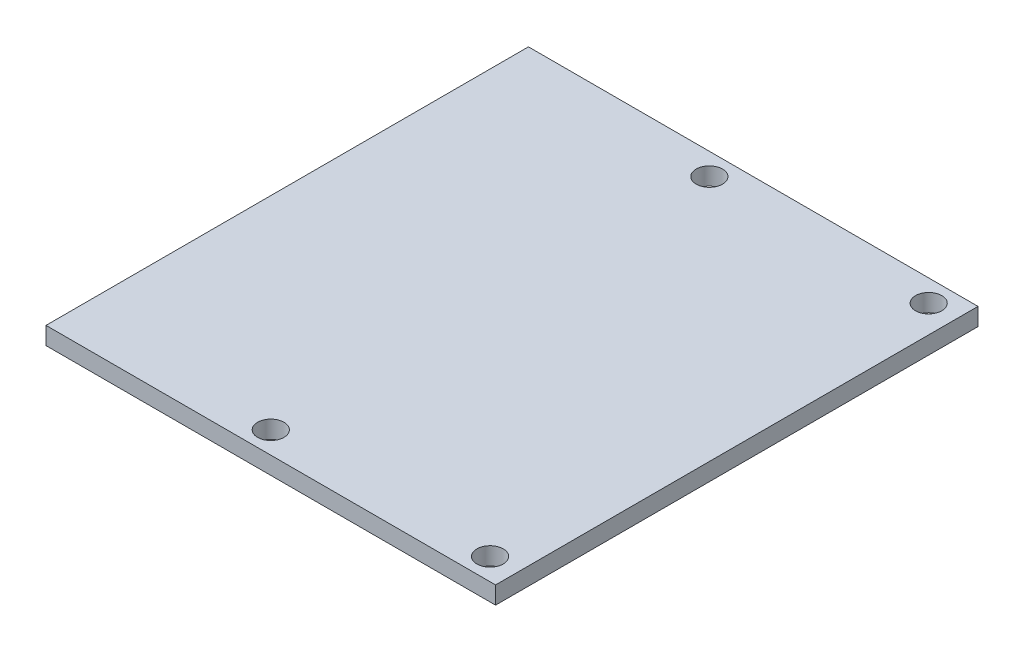
ISO-10303-21;
HEADER;
FILE_DESCRIPTION(('STEP AP214'),'2;1');
FILE_NAME('part.step','',(''),(''),'','','');
FILE_SCHEMA(('AUTOMOTIVE_DESIGN { 1 0 10303 214 1 1 1 1 }'));
ENDSEC;
DATA;
#1=APPLICATION_CONTEXT('core data for automotive mechanical design processes');
#2=APPLICATION_PROTOCOL_DEFINITION('international standard','automotive_design',2000,#1);
#3=PRODUCT_CONTEXT('',#1,'mechanical');
#4=PRODUCT('Part','Part','',(#3));
#5=PRODUCT_RELATED_PRODUCT_CATEGORY('part','',(#4));
#6=PRODUCT_DEFINITION_FORMATION('','',#4);
#7=PRODUCT_DEFINITION_CONTEXT('part definition',#1,'design');
#8=PRODUCT_DEFINITION('design','',#6,#7);
#9=PRODUCT_DEFINITION_SHAPE('','',#8);
#10=(LENGTH_UNIT() NAMED_UNIT(*) SI_UNIT(.MILLI.,.METRE.));
#11=(NAMED_UNIT(*) PLANE_ANGLE_UNIT() SI_UNIT($,.RADIAN.));
#12=(NAMED_UNIT(*) SI_UNIT($,.STERADIAN.) SOLID_ANGLE_UNIT());
#13=UNCERTAINTY_MEASURE_WITH_UNIT(LENGTH_MEASURE(1.E-05),#10,'distance_accuracy_value','');
#14=(GEOMETRIC_REPRESENTATION_CONTEXT(3) GLOBAL_UNCERTAINTY_ASSIGNED_CONTEXT((#13)) GLOBAL_UNIT_ASSIGNED_CONTEXT((#10,
#11,#12)) REPRESENTATION_CONTEXT('',''));
#15=CARTESIAN_POINT('',(0.,0.,0.));
#16=DIRECTION('',(0.,0.,1.));
#17=DIRECTION('',(1.,0.,0.));
#18=AXIS2_PLACEMENT_3D('',#15,#16,#17);
#19=CARTESIAN_POINT('',(0.,1.6,0.));
#20=DIRECTION('',(0.,0.,-1.));
#21=DIRECTION('',(-1.,0.,0.));
#22=AXIS2_PLACEMENT_3D('',#19,#20,#21);
#23=PLANE('',#22);
#24=DIRECTION('',(1.,0.,0.));
#25=VECTOR('',#24,1.);
#26=CARTESIAN_POINT('',(0.,0.,0.));
#27=LINE('',#26,#25);
#28=CARTESIAN_POINT('',(0.,0.,0.));
#29=VERTEX_POINT('',#28);
#30=CARTESIAN_POINT('',(41.,0.,0.));
#31=VERTEX_POINT('',#30);
#32=EDGE_CURVE('E116',#29,#31,#27,.T.);
#33=ORIENTED_EDGE('',*,*,#32,.T.);
#34=DIRECTION('',(0.,-1.,0.));
#35=VECTOR('',#34,1.);
#36=CARTESIAN_POINT('',(41.,1.6,0.));
#37=LINE('',#36,#35);
#38=CARTESIAN_POINT('',(41.,1.6,0.));
#39=VERTEX_POINT('',#38);
#40=EDGE_CURVE('E11',#39,#31,#37,.T.);
#41=ORIENTED_EDGE('',*,*,#40,.F.);
#42=DIRECTION('',(1.,0.,0.));
#43=VECTOR('',#42,1.);
#44=CARTESIAN_POINT('',(0.,1.6,0.));
#45=LINE('',#44,#43);
#46=CARTESIAN_POINT('',(0.,1.6,0.));
#47=VERTEX_POINT('',#46);
#48=EDGE_CURVE('E89',#47,#39,#45,.T.);
#49=ORIENTED_EDGE('',*,*,#48,.F.);
#50=DIRECTION('',(0.,-1.,0.));
#51=VECTOR('',#50,1.);
#52=CARTESIAN_POINT('',(0.,1.6,0.));
#53=LINE('',#52,#51);
#54=EDGE_CURVE('E56',#47,#29,#53,.T.);
#55=ORIENTED_EDGE('',*,*,#54,.T.);
#56=EDGE_LOOP('',(#33,#41,#49,#55));
#57=FACE_BOUND('',#56,.T.);
#58=ADVANCED_FACE('F39',(#57),#23,.F.);
#59=CARTESIAN_POINT('',(41.,1.6,0.));
#60=DIRECTION('',(-1.,0.,0.));
#61=DIRECTION('',(0.,0.,1.));
#62=AXIS2_PLACEMENT_3D('',#59,#60,#61);
#63=PLANE('',#62);
#64=DIRECTION('',(0.,0.,-1.));
#65=VECTOR('',#64,1.);
#66=CARTESIAN_POINT('',(41.,0.,0.));
#67=LINE('',#66,#65);
#68=CARTESIAN_POINT('',(41.,0.,-44.));
#69=VERTEX_POINT('',#68);
#70=EDGE_CURVE('E94',#31,#69,#67,.T.);
#71=ORIENTED_EDGE('',*,*,#70,.T.);
#72=DIRECTION('',(0.,-1.,0.));
#73=VECTOR('',#72,1.);
#74=CARTESIAN_POINT('',(41.,1.6,-44.));
#75=LINE('',#74,#73);
#76=CARTESIAN_POINT('',(41.,1.6,-44.));
#77=VERTEX_POINT('',#76);
#78=EDGE_CURVE('E48',#77,#69,#75,.T.);
#79=ORIENTED_EDGE('',*,*,#78,.F.);
#80=DIRECTION('',(0.,0.,-1.));
#81=VECTOR('',#80,1.);
#82=CARTESIAN_POINT('',(41.,1.6,0.));
#83=LINE('',#82,#81);
#84=EDGE_CURVE('E81',#39,#77,#83,.T.);
#85=ORIENTED_EDGE('',*,*,#84,.F.);
#86=ORIENTED_EDGE('',*,*,#40,.T.);
#87=EDGE_LOOP('',(#71,#79,#85,#86));
#88=FACE_BOUND('',#87,.T.);
#89=ADVANCED_FACE('F93',(#88),#63,.F.);
#90=CARTESIAN_POINT('',(0.,1.6,-44.));
#91=DIRECTION('',(0.,0.,-1.));
#92=DIRECTION('',(-1.,0.,0.));
#93=AXIS2_PLACEMENT_3D('',#90,#91,#92);
#94=PLANE('',#93);
#95=DIRECTION('',(1.,0.,0.));
#96=VECTOR('',#95,1.);
#97=CARTESIAN_POINT('',(0.,0.,-44.));
#98=LINE('',#97,#96);
#99=CARTESIAN_POINT('',(0.,0.,-44.));
#100=VERTEX_POINT('',#99);
#101=EDGE_CURVE('E119',#100,#69,#98,.T.);
#102=ORIENTED_EDGE('',*,*,#101,.F.);
#103=DIRECTION('',(0.,-1.,0.));
#104=VECTOR('',#103,1.);
#105=CARTESIAN_POINT('',(0.,1.6,-44.));
#106=LINE('',#105,#104);
#107=CARTESIAN_POINT('',(0.,1.6,-44.));
#108=VERTEX_POINT('',#107);
#109=EDGE_CURVE('E70',#108,#100,#106,.T.);
#110=ORIENTED_EDGE('',*,*,#109,.F.);
#111=DIRECTION('',(1.,0.,0.));
#112=VECTOR('',#111,1.);
#113=CARTESIAN_POINT('',(0.,1.6,-44.));
#114=LINE('',#113,#112);
#115=EDGE_CURVE('E88',#108,#77,#114,.T.);
#116=ORIENTED_EDGE('',*,*,#115,.T.);
#117=ORIENTED_EDGE('',*,*,#78,.T.);
#118=EDGE_LOOP('',(#102,#110,#116,#117));
#119=FACE_BOUND('',#118,.T.);
#120=ADVANCED_FACE('F97',(#119),#94,.T.);
#121=CARTESIAN_POINT('',(38.5,1.6,-2.));
#122=DIRECTION('',(0.,-1.,0.));
#123=DIRECTION('',(0.,0.,-1.));
#124=AXIS2_PLACEMENT_3D('',#121,#122,#123);
#125=CYLINDRICAL_SURFACE('',#124,1.2);
#126=CARTESIAN_POINT('',(38.5,1.6,-2.));
#127=DIRECTION('',(0.,1.,0.));
#128=DIRECTION('',(0.,0.,1.));
#129=AXIS2_PLACEMENT_3D('',#126,#127,#128);
#130=CIRCLE('',#129,1.2);
#131=CARTESIAN_POINT('',(38.5,1.6,-0.8));
#132=VERTEX_POINT('',#131);
#133=EDGE_CURVE('E138',#132,#132,#130,.T.);
#134=ORIENTED_EDGE('',*,*,#133,.T.);
#135=EDGE_LOOP('',(#134));
#136=FACE_BOUND('',#135,.T.);
#137=CARTESIAN_POINT('',(38.5,0.,-2.));
#138=DIRECTION('',(0.,1.,0.));
#139=DIRECTION('',(0.,0.,1.));
#140=AXIS2_PLACEMENT_3D('',#137,#138,#139);
#141=CIRCLE('',#140,1.2);
#142=CARTESIAN_POINT('',(38.5,0.,-0.8));
#143=VERTEX_POINT('',#142);
#144=EDGE_CURVE('E113',#143,#143,#141,.T.);
#145=ORIENTED_EDGE('',*,*,#144,.F.);
#146=EDGE_LOOP('',(#145));
#147=FACE_BOUND('',#146,.T.);
#148=ADVANCED_FACE('F142',(#136,#147),#125,.F.);
#149=CARTESIAN_POINT('',(38.5,1.6,-42.));
#150=DIRECTION('',(0.,-1.,0.));
#151=DIRECTION('',(0.,0.,-1.));
#152=AXIS2_PLACEMENT_3D('',#149,#150,#151);
#153=CYLINDRICAL_SURFACE('',#152,1.2);
#154=CARTESIAN_POINT('',(38.5,1.6,-42.));
#155=DIRECTION('',(0.,1.,0.));
#156=DIRECTION('',(0.,0.,1.));
#157=AXIS2_PLACEMENT_3D('',#154,#155,#156);
#158=CIRCLE('',#157,1.2);
#159=CARTESIAN_POINT('',(38.5,1.6,-40.8));
#160=VERTEX_POINT('',#159);
#161=EDGE_CURVE('E133',#160,#160,#158,.T.);
#162=ORIENTED_EDGE('',*,*,#161,.T.);
#163=EDGE_LOOP('',(#162));
#164=FACE_BOUND('',#163,.T.);
#165=CARTESIAN_POINT('',(38.5,0.,-42.));
#166=DIRECTION('',(0.,1.,0.));
#167=DIRECTION('',(0.,0.,1.));
#168=AXIS2_PLACEMENT_3D('',#165,#166,#167);
#169=CIRCLE('',#168,1.2);
#170=CARTESIAN_POINT('',(38.5,0.,-40.8));
#171=VERTEX_POINT('',#170);
#172=EDGE_CURVE('E110',#171,#171,#169,.T.);
#173=ORIENTED_EDGE('',*,*,#172,.F.);
#174=EDGE_LOOP('',(#173));
#175=FACE_BOUND('',#174,.T.);
#176=ADVANCED_FACE('F168',(#164,#175),#153,.F.);
#177=CARTESIAN_POINT('',(18.5,1.6,-42.));
#178=DIRECTION('',(0.,-1.,0.));
#179=DIRECTION('',(0.,0.,-1.));
#180=AXIS2_PLACEMENT_3D('',#177,#178,#179);
#181=CYLINDRICAL_SURFACE('',#180,1.2);
#182=CARTESIAN_POINT('',(18.5,1.6,-42.));
#183=DIRECTION('',(0.,1.,0.));
#184=DIRECTION('',(0.,0.,1.));
#185=AXIS2_PLACEMENT_3D('',#182,#183,#184);
#186=CIRCLE('',#185,1.2);
#187=CARTESIAN_POINT('',(18.5,1.6,-40.8));
#188=VERTEX_POINT('',#187);
#189=EDGE_CURVE('E128',#188,#188,#186,.T.);
#190=ORIENTED_EDGE('',*,*,#189,.T.);
#191=EDGE_LOOP('',(#190));
#192=FACE_BOUND('',#191,.T.);
#193=CARTESIAN_POINT('',(18.5,0.,-42.));
#194=DIRECTION('',(0.,1.,0.));
#195=DIRECTION('',(0.,0.,1.));
#196=AXIS2_PLACEMENT_3D('',#193,#194,#195);
#197=CIRCLE('',#196,1.2);
#198=CARTESIAN_POINT('',(18.5,0.,-40.8));
#199=VERTEX_POINT('',#198);
#200=EDGE_CURVE('E107',#199,#199,#197,.T.);
#201=ORIENTED_EDGE('',*,*,#200,.F.);
#202=EDGE_LOOP('',(#201));
#203=FACE_BOUND('',#202,.T.);
#204=ADVANCED_FACE('F170',(#192,#203),#181,.F.);
#205=CARTESIAN_POINT('',(18.5,1.6,-2.));
#206=DIRECTION('',(0.,-1.,0.));
#207=DIRECTION('',(0.,0.,-1.));
#208=AXIS2_PLACEMENT_3D('',#205,#206,#207);
#209=CYLINDRICAL_SURFACE('',#208,1.2);
#210=CARTESIAN_POINT('',(18.5,1.6,-2.));
#211=DIRECTION('',(0.,1.,0.));
#212=DIRECTION('',(0.,0.,1.));
#213=AXIS2_PLACEMENT_3D('',#210,#211,#212);
#214=CIRCLE('',#213,1.2);
#215=CARTESIAN_POINT('',(18.5,1.6,-0.8));
#216=VERTEX_POINT('',#215);
#217=EDGE_CURVE('E124',#216,#216,#214,.T.);
#218=ORIENTED_EDGE('',*,*,#217,.T.);
#219=EDGE_LOOP('',(#218));
#220=FACE_BOUND('',#219,.T.);
#221=CARTESIAN_POINT('',(18.5,0.,-2.));
#222=DIRECTION('',(0.,1.,0.));
#223=DIRECTION('',(0.,0.,1.));
#224=AXIS2_PLACEMENT_3D('',#221,#222,#223);
#225=CIRCLE('',#224,1.2);
#226=CARTESIAN_POINT('',(18.5,0.,-0.8));
#227=VERTEX_POINT('',#226);
#228=EDGE_CURVE('E104',#227,#227,#225,.T.);
#229=ORIENTED_EDGE('',*,*,#228,.F.);
#230=EDGE_LOOP('',(#229));
#231=FACE_BOUND('',#230,.T.);
#232=ADVANCED_FACE('F41',(#220,#231),#209,.F.);
#233=CARTESIAN_POINT('',(0.,1.6,0.));
#234=DIRECTION('',(-1.,0.,0.));
#235=DIRECTION('',(0.,0.,1.));
#236=AXIS2_PLACEMENT_3D('',#233,#234,#235);
#237=PLANE('',#236);
#238=DIRECTION('',(0.,0.,-1.));
#239=VECTOR('',#238,1.);
#240=CARTESIAN_POINT('',(0.,0.,0.));
#241=LINE('',#240,#239);
#242=EDGE_CURVE('E121',#29,#100,#241,.T.);
#243=ORIENTED_EDGE('',*,*,#242,.F.);
#244=ORIENTED_EDGE('',*,*,#54,.F.);
#245=DIRECTION('',(0.,0.,-1.));
#246=VECTOR('',#245,1.);
#247=CARTESIAN_POINT('',(0.,1.6,0.));
#248=LINE('',#247,#246);
#249=EDGE_CURVE('E98',#47,#108,#248,.T.);
#250=ORIENTED_EDGE('',*,*,#249,.T.);
#251=ORIENTED_EDGE('',*,*,#109,.T.);
#252=EDGE_LOOP('',(#243,#244,#250,#251));
#253=FACE_BOUND('',#252,.T.);
#254=ADVANCED_FACE('F147',(#253),#237,.T.);
#255=CARTESIAN_POINT('',(0.,1.6,0.));
#256=DIRECTION('',(0.,1.,0.));
#257=DIRECTION('',(0.,0.,1.));
#258=AXIS2_PLACEMENT_3D('',#255,#256,#257);
#259=PLANE('',#258);
#260=ORIENTED_EDGE('',*,*,#217,.F.);
#261=EDGE_LOOP('',(#260));
#262=FACE_BOUND('',#261,.T.);
#263=ORIENTED_EDGE('',*,*,#189,.F.);
#264=EDGE_LOOP('',(#263));
#265=FACE_BOUND('',#264,.T.);
#266=ORIENTED_EDGE('',*,*,#161,.F.);
#267=EDGE_LOOP('',(#266));
#268=FACE_BOUND('',#267,.T.);
#269=ORIENTED_EDGE('',*,*,#133,.F.);
#270=EDGE_LOOP('',(#269));
#271=FACE_BOUND('',#270,.T.);
#272=ORIENTED_EDGE('',*,*,#48,.T.);
#273=ORIENTED_EDGE('',*,*,#84,.T.);
#274=ORIENTED_EDGE('',*,*,#115,.F.);
#275=ORIENTED_EDGE('',*,*,#249,.F.);
#276=EDGE_LOOP('',(#272,#273,#274,#275));
#277=FACE_BOUND('',#276,.T.);
#278=ADVANCED_FACE('F85',(#262,#265,#268,#271,#277),#259,.T.);
#279=CARTESIAN_POINT('',(0.,0.,0.));
#280=DIRECTION('',(0.,1.,0.));
#281=DIRECTION('',(0.,0.,1.));
#282=AXIS2_PLACEMENT_3D('',#279,#280,#281);
#283=PLANE('',#282);
#284=ORIENTED_EDGE('',*,*,#228,.T.);
#285=EDGE_LOOP('',(#284));
#286=FACE_BOUND('',#285,.T.);
#287=ORIENTED_EDGE('',*,*,#200,.T.);
#288=EDGE_LOOP('',(#287));
#289=FACE_BOUND('',#288,.T.);
#290=ORIENTED_EDGE('',*,*,#172,.T.);
#291=EDGE_LOOP('',(#290));
#292=FACE_BOUND('',#291,.T.);
#293=ORIENTED_EDGE('',*,*,#144,.T.);
#294=EDGE_LOOP('',(#293));
#295=FACE_BOUND('',#294,.T.);
#296=ORIENTED_EDGE('',*,*,#32,.F.);
#297=ORIENTED_EDGE('',*,*,#242,.T.);
#298=ORIENTED_EDGE('',*,*,#101,.T.);
#299=ORIENTED_EDGE('',*,*,#70,.F.);
#300=EDGE_LOOP('',(#296,#297,#298,#299));
#301=FACE_BOUND('',#300,.T.);
#302=ADVANCED_FACE('F146',(#286,#289,#292,#295,#301),#283,.F.);
#303=CLOSED_SHELL('',(#58,#89,#120,#148,#176,#204,#232,#254,#278,#302));
#304=MANIFOLD_SOLID_BREP('B2',#303);
#305=ADVANCED_BREP_SHAPE_REPRESENTATION('',(#18,#304),#14);
#306=SHAPE_DEFINITION_REPRESENTATION(#9,#305);
ENDSEC;
END-ISO-10303-21;
